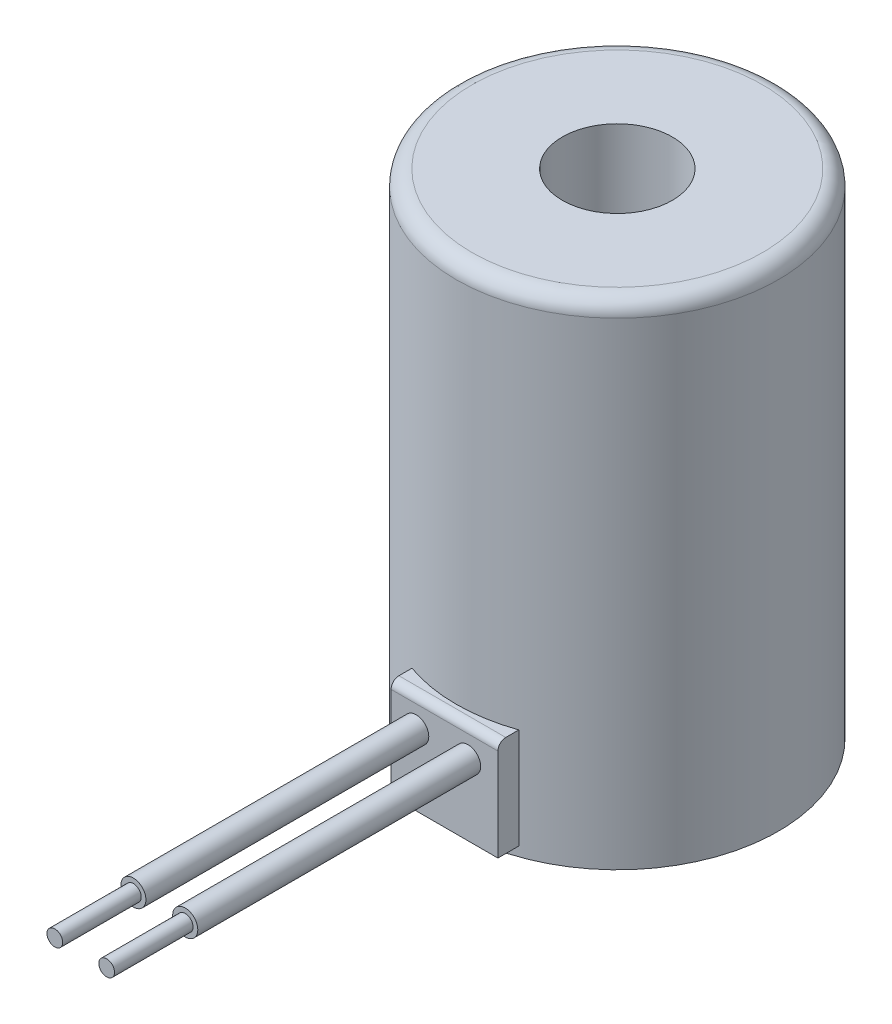
ISO-10303-21;
HEADER;
FILE_DESCRIPTION(('STEP AP214'),'2;1');
FILE_NAME('part.step','',(''),(''),'','','');
FILE_SCHEMA(('AUTOMOTIVE_DESIGN { 1 0 10303 214 1 1 1 1 }'));
ENDSEC;
DATA;
#1=APPLICATION_CONTEXT('core data for automotive mechanical design processes');
#2=APPLICATION_PROTOCOL_DEFINITION('international standard','automotive_design',2000,#1);
#3=PRODUCT_CONTEXT('',#1,'mechanical');
#4=PRODUCT('Part','Part','',(#3));
#5=PRODUCT_RELATED_PRODUCT_CATEGORY('part','',(#4));
#6=PRODUCT_DEFINITION_FORMATION('','',#4);
#7=PRODUCT_DEFINITION_CONTEXT('part definition',#1,'design');
#8=PRODUCT_DEFINITION('design','',#6,#7);
#9=PRODUCT_DEFINITION_SHAPE('','',#8);
#10=(LENGTH_UNIT() NAMED_UNIT(*) SI_UNIT(.MILLI.,.METRE.));
#11=(NAMED_UNIT(*) PLANE_ANGLE_UNIT() SI_UNIT($,.RADIAN.));
#12=(NAMED_UNIT(*) SI_UNIT($,.STERADIAN.) SOLID_ANGLE_UNIT());
#13=UNCERTAINTY_MEASURE_WITH_UNIT(LENGTH_MEASURE(1.E-05),#10,'distance_accuracy_value','');
#14=(GEOMETRIC_REPRESENTATION_CONTEXT(3) GLOBAL_UNCERTAINTY_ASSIGNED_CONTEXT((#13)) GLOBAL_UNIT_ASSIGNED_CONTEXT((#10,
#11,#12)) REPRESENTATION_CONTEXT('',''));
#15=CARTESIAN_POINT('',(0.,0.,0.));
#16=DIRECTION('',(0.,0.,1.));
#17=DIRECTION('',(1.,0.,0.));
#18=AXIS2_PLACEMENT_3D('',#15,#16,#17);
#19=CARTESIAN_POINT('',(-1.8,-10.6,29.));
#20=DIRECTION('',(0.,0.,1.));
#21=DIRECTION('',(1.,0.,0.));
#22=AXIS2_PLACEMENT_3D('',#19,#20,#21);
#23=PLANE('',#22);
#24=CARTESIAN_POINT('',(-1.8,-10.6,29.));
#25=DIRECTION('',(0.,0.,1.));
#26=DIRECTION('',(1.,0.,0.));
#27=AXIS2_PLACEMENT_3D('',#24,#25,#26);
#28=CIRCLE('',#27,0.8);
#29=CARTESIAN_POINT('',(-1.,-10.6,29.));
#30=VERTEX_POINT('',#29);
#31=EDGE_CURVE('E88',#30,#30,#28,.T.);
#32=ORIENTED_EDGE('',*,*,#31,.T.);
#33=EDGE_LOOP('',(#32));
#34=FACE_BOUND('',#33,.T.);
#35=CARTESIAN_POINT('',(-1.8,-10.6,29.));
#36=DIRECTION('',(0.,0.,1.));
#37=DIRECTION('',(1.,0.,0.));
#38=AXIS2_PLACEMENT_3D('',#35,#36,#37);
#39=CIRCLE('',#38,0.5);
#40=CARTESIAN_POINT('',(-1.3,-10.6,29.));
#41=VERTEX_POINT('',#40);
#42=EDGE_CURVE('E191',#41,#41,#39,.T.);
#43=ORIENTED_EDGE('',*,*,#42,.F.);
#44=EDGE_LOOP('',(#43));
#45=FACE_BOUND('',#44,.T.);
#46=ADVANCED_FACE('F34',(#34,#45),#23,.T.);
#47=CARTESIAN_POINT('',(1.5,-10.6,29.));
#48=DIRECTION('',(0.,0.,1.));
#49=DIRECTION('',(1.,0.,0.));
#50=AXIS2_PLACEMENT_3D('',#47,#48,#49);
#51=PLANE('',#50);
#52=CARTESIAN_POINT('',(1.5,-10.6,29.));
#53=DIRECTION('',(0.,0.,1.));
#54=DIRECTION('',(1.,0.,0.));
#55=AXIS2_PLACEMENT_3D('',#52,#53,#54);
#56=CIRCLE('',#55,0.8);
#57=CARTESIAN_POINT('',(2.3,-10.6,29.));
#58=VERTEX_POINT('',#57);
#59=EDGE_CURVE('E209',#58,#58,#56,.T.);
#60=ORIENTED_EDGE('',*,*,#59,.T.);
#61=EDGE_LOOP('',(#60));
#62=FACE_BOUND('',#61,.T.);
#63=CARTESIAN_POINT('',(1.5,-10.6,29.));
#64=DIRECTION('',(0.,0.,1.));
#65=DIRECTION('',(1.,0.,0.));
#66=AXIS2_PLACEMENT_3D('',#63,#64,#65);
#67=CIRCLE('',#66,0.5);
#68=CARTESIAN_POINT('',(2.,-10.6,29.));
#69=VERTEX_POINT('',#68);
#70=EDGE_CURVE('E201',#69,#69,#67,.T.);
#71=ORIENTED_EDGE('',*,*,#70,.F.);
#72=EDGE_LOOP('',(#71));
#73=FACE_BOUND('',#72,.T.);
#74=ADVANCED_FACE('F149',(#62,#73),#51,.T.);
#75=CARTESIAN_POINT('',(-3.4,-15.1,11.));
#76=DIRECTION('',(0.,0.,1.));
#77=DIRECTION('',(1.,0.,0.));
#78=AXIS2_PLACEMENT_3D('',#75,#76,#77);
#79=PLANE('',#78);
#80=CARTESIAN_POINT('',(-1.8,-10.6,11.));
#81=DIRECTION('',(0.,0.,1.));
#82=DIRECTION('',(1.,0.,0.));
#83=AXIS2_PLACEMENT_3D('',#80,#81,#82);
#84=CIRCLE('',#83,0.8);
#85=CARTESIAN_POINT('',(-1.,-10.6,11.));
#86=VERTEX_POINT('',#85);
#87=EDGE_CURVE('E212',#86,#86,#84,.T.);
#88=ORIENTED_EDGE('',*,*,#87,.F.);
#89=EDGE_LOOP('',(#88));
#90=FACE_BOUND('',#89,.T.);
#91=DIRECTION('',(0.,1.,0.));
#92=VECTOR('',#91,1.);
#93=CARTESIAN_POINT('',(3.4,-8.7,11.));
#94=LINE('',#93,#92);
#95=CARTESIAN_POINT('',(3.4,-15.1,11.));
#96=VERTEX_POINT('',#95);
#97=CARTESIAN_POINT('',(3.4,-9.2,11.));
#98=VERTEX_POINT('',#97);
#99=EDGE_CURVE('E98',#96,#98,#94,.T.);
#100=ORIENTED_EDGE('',*,*,#99,.T.);
#101=DIRECTION('',(-1.,0.,0.));
#102=VECTOR('',#101,1.);
#103=CARTESIAN_POINT('',(-3.4,-9.2,11.));
#104=LINE('',#103,#102);
#105=CARTESIAN_POINT('',(-3.4,-9.2,11.));
#106=VERTEX_POINT('',#105);
#107=EDGE_CURVE('E86',#98,#106,#104,.T.);
#108=ORIENTED_EDGE('',*,*,#107,.T.);
#109=DIRECTION('',(0.,-1.,0.));
#110=VECTOR('',#109,1.);
#111=CARTESIAN_POINT('',(-3.4,-8.7,11.));
#112=LINE('',#111,#110);
#113=CARTESIAN_POINT('',(-3.4,-15.1,11.));
#114=VERTEX_POINT('',#113);
#115=EDGE_CURVE('E78',#106,#114,#112,.T.);
#116=ORIENTED_EDGE('',*,*,#115,.T.);
#117=DIRECTION('',(1.,0.,0.));
#118=VECTOR('',#117,1.);
#119=CARTESIAN_POINT('',(-3.4,-15.1,11.));
#120=LINE('',#119,#118);
#121=EDGE_CURVE('E83',#114,#96,#120,.T.);
#122=ORIENTED_EDGE('',*,*,#121,.T.);
#123=EDGE_LOOP('',(#100,#108,#116,#122));
#124=FACE_BOUND('',#123,.T.);
#125=CARTESIAN_POINT('',(1.5,-10.6,11.));
#126=DIRECTION('',(0.,0.,1.));
#127=DIRECTION('',(1.,0.,0.));
#128=AXIS2_PLACEMENT_3D('',#125,#126,#127);
#129=CIRCLE('',#128,0.8);
#130=CARTESIAN_POINT('',(2.3,-10.6,11.));
#131=VERTEX_POINT('',#130);
#132=EDGE_CURVE('E206',#131,#131,#129,.T.);
#133=ORIENTED_EDGE('',*,*,#132,.F.);
#134=EDGE_LOOP('',(#133));
#135=FACE_BOUND('',#134,.T.);
#136=ADVANCED_FACE('F81',(#90,#124,#135),#79,.T.);
#137=CARTESIAN_POINT('',(0.,15.7,0.));
#138=DIRECTION('',(0.,-1.,0.));
#139=DIRECTION('',(0.,0.,-1.));
#140=AXIS2_PLACEMENT_3D('',#137,#138,#139);
#141=CYLINDRICAL_SURFACE('',#140,10.25);
#142=CARTESIAN_POINT('',(0.,-15.7,0.));
#143=DIRECTION('',(0.,1.,0.));
#144=DIRECTION('',(0.,0.,1.));
#145=AXIS2_PLACEMENT_3D('',#142,#143,#144);
#146=CIRCLE('',#145,10.25);
#147=CARTESIAN_POINT('',(0.,-15.7,10.25));
#148=VERTEX_POINT('',#147);
#149=EDGE_CURVE('E104',#148,#148,#146,.T.);
#150=ORIENTED_EDGE('',*,*,#149,.T.);
#151=EDGE_LOOP('',(#150));
#152=FACE_BOUND('',#151,.T.);
#153=CARTESIAN_POINT('',(0.,14.7,0.));
#154=DIRECTION('',(0.,1.,0.));
#155=DIRECTION('',(0.,0.,1.));
#156=AXIS2_PLACEMENT_3D('',#153,#154,#155);
#157=CIRCLE('',#156,10.25);
#158=CARTESIAN_POINT('',(0.,14.7,10.25));
#159=VERTEX_POINT('',#158);
#160=EDGE_CURVE('E115',#159,#159,#157,.F.);
#161=ORIENTED_EDGE('',*,*,#160,.T.);
#162=EDGE_LOOP('',(#161));
#163=FACE_BOUND('',#162,.T.);
#164=DIRECTION('',(0.,-1.,0.));
#165=VECTOR('',#164,1.);
#166=CARTESIAN_POINT('',(-3.39999999999999,15.7,9.66966907396526));
#167=LINE('',#166,#165);
#168=CARTESIAN_POINT('',(-3.4,-8.7,9.66966907396525));
#169=VERTEX_POINT('',#168);
#170=CARTESIAN_POINT('',(-3.4,-15.1,9.66966907396525));
#171=VERTEX_POINT('',#170);
#172=EDGE_CURVE('E103',#169,#171,#167,.T.);
#173=ORIENTED_EDGE('',*,*,#172,.F.);
#174=CARTESIAN_POINT('',(0.,-8.7,0.));
#175=DIRECTION('',(0.,-1.,0.));
#176=DIRECTION('',(1.,0.,0.));
#177=AXIS2_PLACEMENT_3D('',#174,#175,#176);
#178=CIRCLE('',#177,10.25);
#179=CARTESIAN_POINT('',(3.4,-8.7,9.66966907396525));
#180=VERTEX_POINT('',#179);
#181=EDGE_CURVE('E118',#180,#169,#178,.T.);
#182=ORIENTED_EDGE('',*,*,#181,.F.);
#183=DIRECTION('',(0.,-1.,0.));
#184=VECTOR('',#183,1.);
#185=CARTESIAN_POINT('',(3.4,15.7,9.66966907396525));
#186=LINE('',#185,#184);
#187=CARTESIAN_POINT('',(3.4,-15.1,9.66966907396525));
#188=VERTEX_POINT('',#187);
#189=EDGE_CURVE('E121',#188,#180,#186,.F.);
#190=ORIENTED_EDGE('',*,*,#189,.F.);
#191=CARTESIAN_POINT('',(0.,-15.1,0.));
#192=DIRECTION('',(0.,1.,0.));
#193=DIRECTION('',(0.,0.,1.));
#194=AXIS2_PLACEMENT_3D('',#191,#192,#193);
#195=CIRCLE('',#194,10.25);
#196=EDGE_CURVE('E124',#171,#188,#195,.T.);
#197=ORIENTED_EDGE('',*,*,#196,.F.);
#198=EDGE_LOOP('',(#173,#182,#190,#197));
#199=FACE_BOUND('',#198,.T.);
#200=ADVANCED_FACE('F137',(#152,#163,#199),#141,.T.);
#201=CARTESIAN_POINT('',(0.,15.7,0.));
#202=DIRECTION('',(0.,1.,0.));
#203=DIRECTION('',(0.,0.,1.));
#204=AXIS2_PLACEMENT_3D('',#201,#202,#203);
#205=PLANE('',#204);
#206=CARTESIAN_POINT('',(0.,15.7,0.));
#207=DIRECTION('',(0.,1.,0.));
#208=DIRECTION('',(0.,0.,1.));
#209=AXIS2_PLACEMENT_3D('',#206,#207,#208);
#210=CIRCLE('',#209,3.5);
#211=CARTESIAN_POINT('',(0.,15.7,3.5));
#212=VERTEX_POINT('',#211);
#213=EDGE_CURVE('E192',#212,#212,#210,.T.);
#214=ORIENTED_EDGE('',*,*,#213,.F.);
#215=EDGE_LOOP('',(#214));
#216=FACE_BOUND('',#215,.T.);
#217=CARTESIAN_POINT('',(0.,15.7,0.));
#218=DIRECTION('',(0.,1.,0.));
#219=DIRECTION('',(0.,0.,1.));
#220=AXIS2_PLACEMENT_3D('',#217,#218,#219);
#221=CIRCLE('',#220,9.25);
#222=CARTESIAN_POINT('',(0.,15.7,9.25));
#223=VERTEX_POINT('',#222);
#224=EDGE_CURVE('E107',#223,#223,#221,.T.);
#225=ORIENTED_EDGE('',*,*,#224,.T.);
#226=EDGE_LOOP('',(#225));
#227=FACE_BOUND('',#226,.T.);
#228=ADVANCED_FACE('F139',(#216,#227),#205,.T.);
#229=CARTESIAN_POINT('',(0.,-15.7,0.));
#230=DIRECTION('',(0.,1.,0.));
#231=DIRECTION('',(0.,0.,1.));
#232=AXIS2_PLACEMENT_3D('',#229,#230,#231);
#233=PLANE('',#232);
#234=CARTESIAN_POINT('',(0.,-15.7,0.));
#235=DIRECTION('',(0.,1.,0.));
#236=DIRECTION('',(0.,0.,1.));
#237=AXIS2_PLACEMENT_3D('',#234,#235,#236);
#238=CIRCLE('',#237,3.5);
#239=CARTESIAN_POINT('',(0.,-15.7,3.5));
#240=VERTEX_POINT('',#239);
#241=EDGE_CURVE('E188',#240,#240,#238,.T.);
#242=ORIENTED_EDGE('',*,*,#241,.T.);
#243=EDGE_LOOP('',(#242));
#244=FACE_BOUND('',#243,.T.);
#245=ORIENTED_EDGE('',*,*,#149,.F.);
#246=EDGE_LOOP('',(#245));
#247=FACE_BOUND('',#246,.T.);
#248=ADVANCED_FACE('F146',(#244,#247),#233,.F.);
#249=CARTESIAN_POINT('',(0.,14.7,0.));
#250=DIRECTION('',(0.,1.,0.));
#251=DIRECTION('',(0.,0.,1.));
#252=AXIS2_PLACEMENT_3D('',#249,#250,#251);
#253=TOROIDAL_SURFACE('',#252,9.25,1.);
#254=ORIENTED_EDGE('',*,*,#160,.F.);
#255=EDGE_LOOP('',(#254));
#256=FACE_BOUND('',#255,.T.);
#257=ORIENTED_EDGE('',*,*,#224,.F.);
#258=EDGE_LOOP('',(#257));
#259=FACE_BOUND('',#258,.T.);
#260=ADVANCED_FACE('F178',(#256,#259),#253,.T.);
#261=CARTESIAN_POINT('',(-3.4,-8.7,11.));
#262=DIRECTION('',(1.,0.,0.));
#263=DIRECTION('',(0.,1.,0.));
#264=AXIS2_PLACEMENT_3D('',#261,#262,#263);
#265=PLANE('',#264);
#266=ORIENTED_EDGE('',*,*,#115,.F.);
#267=CARTESIAN_POINT('',(-3.4,-9.2,10.5));
#268=DIRECTION('',(1.,0.,0.));
#269=DIRECTION('',(0.,1.,0.));
#270=AXIS2_PLACEMENT_3D('',#267,#268,#269);
#271=CIRCLE('',#270,0.5);
#272=CARTESIAN_POINT('',(-3.4,-8.7,10.5));
#273=VERTEX_POINT('',#272);
#274=EDGE_CURVE('E56',#106,#273,#271,.F.);
#275=ORIENTED_EDGE('',*,*,#274,.T.);
#276=DIRECTION('',(0.,0.,-1.));
#277=VECTOR('',#276,1.);
#278=CARTESIAN_POINT('',(-3.4,-8.7,11.));
#279=LINE('',#278,#277);
#280=EDGE_CURVE('E132',#273,#169,#279,.T.);
#281=ORIENTED_EDGE('',*,*,#280,.T.);
#282=ORIENTED_EDGE('',*,*,#172,.T.);
#283=DIRECTION('',(0.,0.,-1.));
#284=VECTOR('',#283,1.);
#285=CARTESIAN_POINT('',(-3.4,-15.1,11.));
#286=LINE('',#285,#284);
#287=EDGE_CURVE('E94',#114,#171,#286,.T.);
#288=ORIENTED_EDGE('',*,*,#287,.F.);
#289=EDGE_LOOP('',(#266,#275,#281,#282,#288));
#290=FACE_BOUND('',#289,.T.);
#291=ADVANCED_FACE('F101',(#290),#265,.F.);
#292=CARTESIAN_POINT('',(-3.4,-15.1,11.));
#293=DIRECTION('',(0.,1.,0.));
#294=DIRECTION('',(0.,0.,1.));
#295=AXIS2_PLACEMENT_3D('',#292,#293,#294);
#296=PLANE('',#295);
#297=ORIENTED_EDGE('',*,*,#287,.T.);
#298=ORIENTED_EDGE('',*,*,#196,.T.);
#299=DIRECTION('',(0.,0.,-1.));
#300=VECTOR('',#299,1.);
#301=CARTESIAN_POINT('',(3.4,-15.1,11.));
#302=LINE('',#301,#300);
#303=EDGE_CURVE('E96',#96,#188,#302,.T.);
#304=ORIENTED_EDGE('',*,*,#303,.F.);
#305=ORIENTED_EDGE('',*,*,#121,.F.);
#306=EDGE_LOOP('',(#297,#298,#304,#305));
#307=FACE_BOUND('',#306,.T.);
#308=ADVANCED_FACE('F92',(#307),#296,.F.);
#309=CARTESIAN_POINT('',(3.4,-8.7,11.));
#310=DIRECTION('',(-1.,0.,0.));
#311=DIRECTION('',(0.,-1.,0.));
#312=AXIS2_PLACEMENT_3D('',#309,#310,#311);
#313=PLANE('',#312);
#314=DIRECTION('',(0.,0.,-1.));
#315=VECTOR('',#314,1.);
#316=CARTESIAN_POINT('',(3.4,-8.7,11.));
#317=LINE('',#316,#315);
#318=CARTESIAN_POINT('',(3.4,-8.7,10.5));
#319=VERTEX_POINT('',#318);
#320=EDGE_CURVE('E109',#319,#180,#317,.T.);
#321=ORIENTED_EDGE('',*,*,#320,.F.);
#322=CARTESIAN_POINT('',(3.4,-9.2,10.5));
#323=DIRECTION('',(-1.,0.,0.));
#324=DIRECTION('',(0.,-1.,0.));
#325=AXIS2_PLACEMENT_3D('',#322,#323,#324);
#326=CIRCLE('',#325,0.5);
#327=EDGE_CURVE('E11',#319,#98,#326,.F.);
#328=ORIENTED_EDGE('',*,*,#327,.T.);
#329=ORIENTED_EDGE('',*,*,#99,.F.);
#330=ORIENTED_EDGE('',*,*,#303,.T.);
#331=ORIENTED_EDGE('',*,*,#189,.T.);
#332=EDGE_LOOP('',(#321,#328,#329,#330,#331));
#333=FACE_BOUND('',#332,.T.);
#334=ADVANCED_FACE('F130',(#333),#313,.F.);
#335=CARTESIAN_POINT('',(-3.4,-8.7,11.));
#336=DIRECTION('',(0.,-1.,0.));
#337=DIRECTION('',(1.,0.,0.));
#338=AXIS2_PLACEMENT_3D('',#335,#336,#337);
#339=PLANE('',#338);
#340=ORIENTED_EDGE('',*,*,#280,.F.);
#341=DIRECTION('',(-1.,0.,0.));
#342=VECTOR('',#341,1.);
#343=CARTESIAN_POINT('',(3.4,-8.7,10.5));
#344=LINE('',#343,#342);
#345=EDGE_CURVE('E42',#273,#319,#344,.F.);
#346=ORIENTED_EDGE('',*,*,#345,.T.);
#347=ORIENTED_EDGE('',*,*,#320,.T.);
#348=ORIENTED_EDGE('',*,*,#181,.T.);
#349=EDGE_LOOP('',(#340,#346,#347,#348));
#350=FACE_BOUND('',#349,.T.);
#351=ADVANCED_FACE('F136',(#350),#339,.F.);
#352=CARTESIAN_POINT('',(-3.4,-9.2,10.5));
#353=DIRECTION('',(1.,0.,0.));
#354=DIRECTION('',(0.,1.,0.));
#355=AXIS2_PLACEMENT_3D('',#352,#353,#354);
#356=CYLINDRICAL_SURFACE('',#355,0.5);
#357=ORIENTED_EDGE('',*,*,#327,.F.);
#358=ORIENTED_EDGE('',*,*,#345,.F.);
#359=ORIENTED_EDGE('',*,*,#274,.F.);
#360=ORIENTED_EDGE('',*,*,#107,.F.);
#361=EDGE_LOOP('',(#357,#358,#359,#360));
#362=FACE_BOUND('',#361,.T.);
#363=ADVANCED_FACE('F36',(#362),#356,.T.);
#364=CARTESIAN_POINT('',(-1.8,-10.6,29.));
#365=DIRECTION('',(0.,0.,-1.));
#366=DIRECTION('',(-1.,0.,0.));
#367=AXIS2_PLACEMENT_3D('',#364,#365,#366);
#368=CYLINDRICAL_SURFACE('',#367,0.8);
#369=ORIENTED_EDGE('',*,*,#31,.F.);
#370=EDGE_LOOP('',(#369));
#371=FACE_BOUND('',#370,.T.);
#372=ORIENTED_EDGE('',*,*,#87,.T.);
#373=EDGE_LOOP('',(#372));
#374=FACE_BOUND('',#373,.T.);
#375=ADVANCED_FACE('F167',(#371,#374),#368,.T.);
#376=CARTESIAN_POINT('',(1.5,-10.6,29.));
#377=DIRECTION('',(0.,0.,-1.));
#378=DIRECTION('',(-1.,0.,0.));
#379=AXIS2_PLACEMENT_3D('',#376,#377,#378);
#380=CYLINDRICAL_SURFACE('',#379,0.8);
#381=ORIENTED_EDGE('',*,*,#59,.F.);
#382=EDGE_LOOP('',(#381));
#383=FACE_BOUND('',#382,.T.);
#384=ORIENTED_EDGE('',*,*,#132,.T.);
#385=EDGE_LOOP('',(#384));
#386=FACE_BOUND('',#385,.T.);
#387=ADVANCED_FACE('F166',(#383,#386),#380,.T.);
#388=CARTESIAN_POINT('',(1.5,-10.6,34.));
#389=DIRECTION('',(0.,0.,-1.));
#390=DIRECTION('',(-1.,0.,0.));
#391=AXIS2_PLACEMENT_3D('',#388,#389,#390);
#392=CYLINDRICAL_SURFACE('',#391,0.5);
#393=CARTESIAN_POINT('',(1.5,-10.6,34.));
#394=DIRECTION('',(0.,0.,1.));
#395=DIRECTION('',(1.,0.,0.));
#396=AXIS2_PLACEMENT_3D('',#393,#394,#395);
#397=CIRCLE('',#396,0.5);
#398=CARTESIAN_POINT('',(2.,-10.6,34.));
#399=VERTEX_POINT('',#398);
#400=EDGE_CURVE('E203',#399,#399,#397,.T.);
#401=ORIENTED_EDGE('',*,*,#400,.F.);
#402=EDGE_LOOP('',(#401));
#403=FACE_BOUND('',#402,.T.);
#404=ORIENTED_EDGE('',*,*,#70,.T.);
#405=EDGE_LOOP('',(#404));
#406=FACE_BOUND('',#405,.T.);
#407=ADVANCED_FACE('F223',(#403,#406),#392,.T.);
#408=CARTESIAN_POINT('',(1.5,-10.6,34.));
#409=DIRECTION('',(0.,0.,1.));
#410=DIRECTION('',(1.,0.,0.));
#411=AXIS2_PLACEMENT_3D('',#408,#409,#410);
#412=PLANE('',#411);
#413=ORIENTED_EDGE('',*,*,#400,.T.);
#414=EDGE_LOOP('',(#413));
#415=FACE_BOUND('',#414,.T.);
#416=ADVANCED_FACE('F228',(#415),#412,.T.);
#417=CARTESIAN_POINT('',(-1.8,-10.6,34.));
#418=DIRECTION('',(0.,0.,-1.));
#419=DIRECTION('',(-1.,0.,0.));
#420=AXIS2_PLACEMENT_3D('',#417,#418,#419);
#421=CYLINDRICAL_SURFACE('',#420,0.5);
#422=CARTESIAN_POINT('',(-1.8,-10.6,34.));
#423=DIRECTION('',(0.,0.,1.));
#424=DIRECTION('',(1.,0.,0.));
#425=AXIS2_PLACEMENT_3D('',#422,#423,#424);
#426=CIRCLE('',#425,0.5);
#427=CARTESIAN_POINT('',(-1.3,-10.6,34.));
#428=VERTEX_POINT('',#427);
#429=EDGE_CURVE('E195',#428,#428,#426,.T.);
#430=ORIENTED_EDGE('',*,*,#429,.F.);
#431=EDGE_LOOP('',(#430));
#432=FACE_BOUND('',#431,.T.);
#433=ORIENTED_EDGE('',*,*,#42,.T.);
#434=EDGE_LOOP('',(#433));
#435=FACE_BOUND('',#434,.T.);
#436=ADVANCED_FACE('F238',(#432,#435),#421,.T.);
#437=CARTESIAN_POINT('',(-1.8,-10.6,34.));
#438=DIRECTION('',(0.,0.,1.));
#439=DIRECTION('',(1.,0.,0.));
#440=AXIS2_PLACEMENT_3D('',#437,#438,#439);
#441=PLANE('',#440);
#442=ORIENTED_EDGE('',*,*,#429,.T.);
#443=EDGE_LOOP('',(#442));
#444=FACE_BOUND('',#443,.T.);
#445=ADVANCED_FACE('F245',(#444),#441,.T.);
#446=CARTESIAN_POINT('',(0.,-15.7,0.));
#447=DIRECTION('',(0.,1.,0.));
#448=DIRECTION('',(0.,0.,1.));
#449=AXIS2_PLACEMENT_3D('',#446,#447,#448);
#450=CYLINDRICAL_SURFACE('',#449,3.5);
#451=ORIENTED_EDGE('',*,*,#241,.F.);
#452=EDGE_LOOP('',(#451));
#453=FACE_BOUND('',#452,.T.);
#454=ORIENTED_EDGE('',*,*,#213,.T.);
#455=EDGE_LOOP('',(#454));
#456=FACE_BOUND('',#455,.T.);
#457=ADVANCED_FACE('F249',(#453,#456),#450,.F.);
#458=CLOSED_SHELL('',(#46,#74,#136,#200,#228,#248,#260,#291,#308,#334,#351,#363,#375,#387,#407,
#416,#436,#445,#457));
#459=MANIFOLD_SOLID_BREP('B2',#458);
#460=ADVANCED_BREP_SHAPE_REPRESENTATION('',(#18,#459),#14);
#461=SHAPE_DEFINITION_REPRESENTATION(#9,#460);
ENDSEC;
END-ISO-10303-21;
